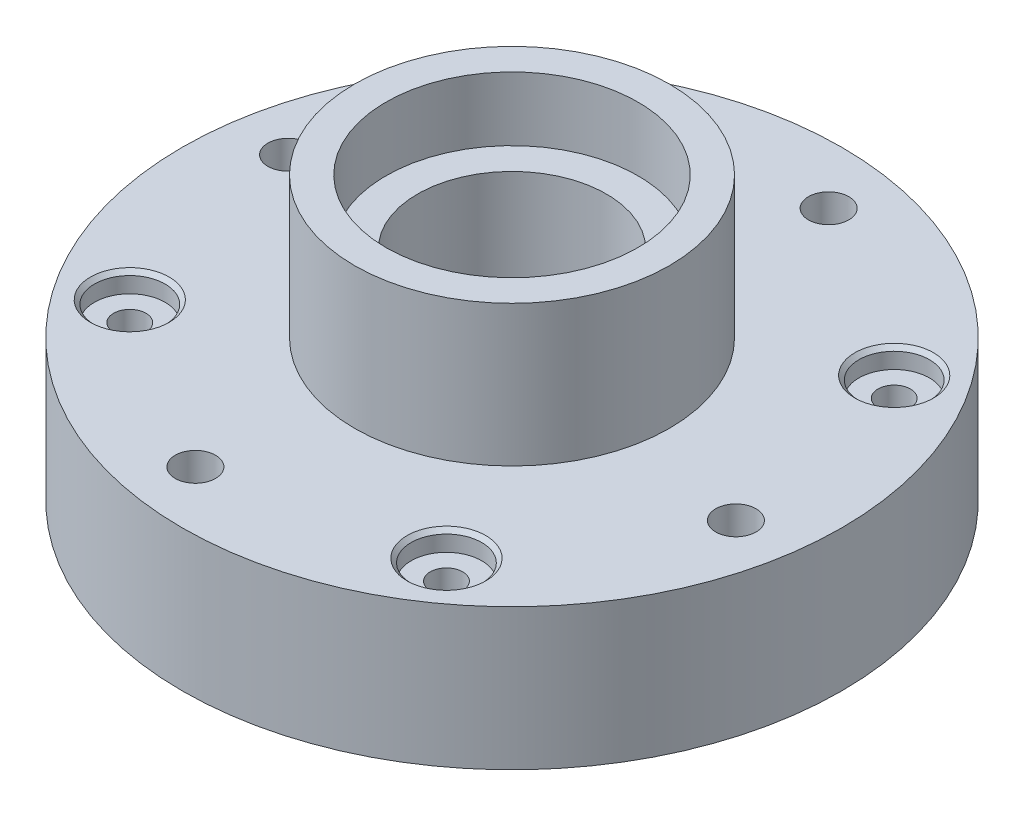
ISO-10303-21;
HEADER;
FILE_DESCRIPTION(('STEP AP214'),'2;1');
FILE_NAME('part.step','',(''),(''),'','','');
FILE_SCHEMA(('AUTOMOTIVE_DESIGN { 1 0 10303 214 1 1 1 1 }'));
ENDSEC;
DATA;
#1=APPLICATION_CONTEXT('core data for automotive mechanical design processes');
#2=APPLICATION_PROTOCOL_DEFINITION('international standard','automotive_design',2000,#1);
#3=PRODUCT_CONTEXT('',#1,'mechanical');
#4=PRODUCT('Part','Part','',(#3));
#5=PRODUCT_RELATED_PRODUCT_CATEGORY('part','',(#4));
#6=PRODUCT_DEFINITION_FORMATION('','',#4);
#7=PRODUCT_DEFINITION_CONTEXT('part definition',#1,'design');
#8=PRODUCT_DEFINITION('design','',#6,#7);
#9=PRODUCT_DEFINITION_SHAPE('','',#8);
#10=(LENGTH_UNIT() NAMED_UNIT(*) SI_UNIT(.MILLI.,.METRE.));
#11=(NAMED_UNIT(*) PLANE_ANGLE_UNIT() SI_UNIT($,.RADIAN.));
#12=(NAMED_UNIT(*) SI_UNIT($,.STERADIAN.) SOLID_ANGLE_UNIT());
#13=UNCERTAINTY_MEASURE_WITH_UNIT(LENGTH_MEASURE(1.E-05),#10,'distance_accuracy_value','');
#14=(GEOMETRIC_REPRESENTATION_CONTEXT(3) GLOBAL_UNCERTAINTY_ASSIGNED_CONTEXT((#13)) GLOBAL_UNIT_ASSIGNED_CONTEXT((#10,
#11,#12)) REPRESENTATION_CONTEXT('',''));
#15=CARTESIAN_POINT('',(0.,0.,0.));
#16=DIRECTION('',(0.,0.,1.));
#17=DIRECTION('',(1.,0.,0.));
#18=AXIS2_PLACEMENT_3D('',#15,#16,#17);
#19=CARTESIAN_POINT('',(0.,36.4264778325123,0.));
#20=DIRECTION('',(0.,1.,0.));
#21=DIRECTION('',(0.,0.,1.));
#22=AXIS2_PLACEMENT_3D('',#19,#20,#21);
#23=CYLINDRICAL_SURFACE('',#22,24.7674954336636);
#24=CARTESIAN_POINT('',(0.,36.4264778325123,0.));
#25=DIRECTION('',(0.,1.,0.));
#26=DIRECTION('',(0.,0.,1.));
#27=AXIS2_PLACEMENT_3D('',#24,#25,#26);
#28=CIRCLE('',#27,24.7674954336636);
#29=CARTESIAN_POINT('',(0.,36.4264778325123,24.7674954336636));
#30=VERTEX_POINT('',#29);
#31=EDGE_CURVE('E11',#30,#30,#28,.T.);
#32=ORIENTED_EDGE('',*,*,#31,.F.);
#33=EDGE_LOOP('',(#32));
#34=FACE_BOUND('',#33,.T.);
#35=CARTESIAN_POINT('',(0.,14.2483990147783,0.));
#36=DIRECTION('',(0.,1.,0.));
#37=DIRECTION('',(0.,0.,1.));
#38=AXIS2_PLACEMENT_3D('',#35,#36,#37);
#39=CIRCLE('',#38,24.7674954336636);
#40=CARTESIAN_POINT('',(0.,14.2483990147783,24.7674954336636));
#41=VERTEX_POINT('',#40);
#42=EDGE_CURVE('E104',#41,#41,#39,.T.);
#43=ORIENTED_EDGE('',*,*,#42,.T.);
#44=EDGE_LOOP('',(#43));
#45=FACE_BOUND('',#44,.T.);
#46=ADVANCED_FACE('F31',(#34,#45),#23,.T.);
#47=CARTESIAN_POINT('',(19.8390678207927,36.4264778325123,0.));
#48=DIRECTION('',(0.,-1.,0.));
#49=DIRECTION('',(0.,0.,-1.));
#50=AXIS2_PLACEMENT_3D('',#47,#48,#49);
#51=PLANE('',#50);
#52=CARTESIAN_POINT('',(0.,36.4264778325123,0.));
#53=DIRECTION('',(0.,1.,0.));
#54=DIRECTION('',(0.,0.,1.));
#55=AXIS2_PLACEMENT_3D('',#52,#53,#54);
#56=CIRCLE('',#55,19.8390678207927);
#57=CARTESIAN_POINT('',(0.,36.4264778325123,19.8390678207927));
#58=VERTEX_POINT('',#57);
#59=EDGE_CURVE('E38',#58,#58,#56,.T.);
#60=ORIENTED_EDGE('',*,*,#59,.F.);
#61=EDGE_LOOP('',(#60));
#62=FACE_BOUND('',#61,.T.);
#63=ORIENTED_EDGE('',*,*,#31,.T.);
#64=EDGE_LOOP('',(#63));
#65=FACE_BOUND('',#64,.T.);
#66=ADVANCED_FACE('F126',(#62,#65),#51,.F.);
#67=CARTESIAN_POINT('',(0.,36.4264778325123,0.));
#68=DIRECTION('',(0.,1.,0.));
#69=DIRECTION('',(0.,0.,1.));
#70=AXIS2_PLACEMENT_3D('',#67,#68,#69);
#71=CYLINDRICAL_SURFACE('',#70,19.8390678207927);
#72=CARTESIAN_POINT('',(0.,26.3797052630036,0.));
#73=DIRECTION('',(0.,1.,0.));
#74=DIRECTION('',(0.,0.,1.));
#75=AXIS2_PLACEMENT_3D('',#72,#73,#74);
#76=CIRCLE('',#75,19.8390678207927);
#77=CARTESIAN_POINT('',(0.,26.3797052630036,19.8390678207927));
#78=VERTEX_POINT('',#77);
#79=EDGE_CURVE('E119',#78,#78,#76,.T.);
#80=ORIENTED_EDGE('',*,*,#79,.F.);
#81=EDGE_LOOP('',(#80));
#82=FACE_BOUND('',#81,.T.);
#83=ORIENTED_EDGE('',*,*,#59,.T.);
#84=EDGE_LOOP('',(#83));
#85=FACE_BOUND('',#84,.T.);
#86=ADVANCED_FACE('F124',(#82,#85),#71,.F.);
#87=CARTESIAN_POINT('',(19.8390678207927,26.3797052630036,0.));
#88=DIRECTION('',(0.,-1.,0.));
#89=DIRECTION('',(0.,0.,-1.));
#90=AXIS2_PLACEMENT_3D('',#87,#88,#89);
#91=PLANE('',#90);
#92=CARTESIAN_POINT('',(0.,26.3797052630036,0.));
#93=DIRECTION('',(0.,1.,0.));
#94=DIRECTION('',(0.,0.,1.));
#95=AXIS2_PLACEMENT_3D('',#92,#93,#94);
#96=CIRCLE('',#95,14.8706651695587);
#97=CARTESIAN_POINT('',(0.,26.3797052630036,14.8706651695587));
#98=VERTEX_POINT('',#97);
#99=EDGE_CURVE('E116',#98,#98,#96,.T.);
#100=ORIENTED_EDGE('',*,*,#99,.F.);
#101=EDGE_LOOP('',(#100));
#102=FACE_BOUND('',#101,.T.);
#103=ORIENTED_EDGE('',*,*,#79,.T.);
#104=EDGE_LOOP('',(#103));
#105=FACE_BOUND('',#104,.T.);
#106=ADVANCED_FACE('F159',(#102,#105),#91,.F.);
#107=CARTESIAN_POINT('',(0.,36.4264778325123,0.));
#108=DIRECTION('',(0.,1.,0.));
#109=DIRECTION('',(0.,0.,1.));
#110=AXIS2_PLACEMENT_3D('',#107,#108,#109);
#111=CYLINDRICAL_SURFACE('',#110,14.8706651695587);
#112=CARTESIAN_POINT('',(0.,-7.97660098522167,0.));
#113=DIRECTION('',(0.,1.,0.));
#114=DIRECTION('',(0.,0.,1.));
#115=AXIS2_PLACEMENT_3D('',#112,#113,#114);
#116=CIRCLE('',#115,14.8706651695587);
#117=CARTESIAN_POINT('',(0.,-7.97660098522167,14.8706651695587));
#118=VERTEX_POINT('',#117);
#119=EDGE_CURVE('E113',#118,#118,#116,.T.);
#120=ORIENTED_EDGE('',*,*,#119,.F.);
#121=EDGE_LOOP('',(#120));
#122=FACE_BOUND('',#121,.T.);
#123=ORIENTED_EDGE('',*,*,#99,.T.);
#124=EDGE_LOOP('',(#123));
#125=FACE_BOUND('',#124,.T.);
#126=ADVANCED_FACE('F152',(#122,#125),#111,.F.);
#127=CARTESIAN_POINT('',(51.8879387834173,-7.97660098522167,0.));
#128=DIRECTION('',(0.,1.,0.));
#129=DIRECTION('',(0.,0.,1.));
#130=AXIS2_PLACEMENT_3D('',#127,#128,#129);
#131=PLANE('',#130);
#132=CARTESIAN_POINT('',(24.9173405201599,-7.97660098522167,35.2340836924472));
#133=DIRECTION('',(0.,1.,0.));
#134=DIRECTION('',(0.,0.,1.));
#135=AXIS2_PLACEMENT_3D('',#132,#133,#134);
#136=CIRCLE('',#135,2.55269999999999);
#137=CARTESIAN_POINT('',(24.9173405201599,-7.97660098522167,37.7867836924472));
#138=VERTEX_POINT('',#137);
#139=EDGE_CURVE('E308',#138,#138,#136,.T.);
#140=ORIENTED_EDGE('',*,*,#139,.T.);
#141=EDGE_LOOP('',(#140));
#142=FACE_BOUND('',#141,.T.);
#143=CARTESIAN_POINT('',(-35.2340836924473,-7.97660098522167,24.9173405201598));
#144=DIRECTION('',(0.,1.,0.));
#145=DIRECTION('',(0.,0.,1.));
#146=AXIS2_PLACEMENT_3D('',#143,#144,#145);
#147=CIRCLE('',#146,2.5527);
#148=CARTESIAN_POINT('',(-35.2340836924473,-7.97660098522167,27.4700405201598));
#149=VERTEX_POINT('',#148);
#150=EDGE_CURVE('E323',#149,#149,#147,.T.);
#151=ORIENTED_EDGE('',*,*,#150,.T.);
#152=EDGE_LOOP('',(#151));
#153=FACE_BOUND('',#152,.T.);
#154=CARTESIAN_POINT('',(-24.9173405201597,-7.97660098522167,-35.2340836924474));
#155=DIRECTION('',(0.,1.,0.));
#156=DIRECTION('',(0.,0.,1.));
#157=AXIS2_PLACEMENT_3D('',#154,#155,#156);
#158=CIRCLE('',#157,2.55269999999999);
#159=CARTESIAN_POINT('',(-24.9173405201597,-7.97660098522167,-32.6813836924474));
#160=VERTEX_POINT('',#159);
#161=EDGE_CURVE('E338',#160,#160,#158,.T.);
#162=ORIENTED_EDGE('',*,*,#161,.T.);
#163=EDGE_LOOP('',(#162));
#164=FACE_BOUND('',#163,.T.);
#165=CARTESIAN_POINT('',(35.2340836924475,-7.97660098522167,-24.9173405201596));
#166=DIRECTION('',(0.,1.,0.));
#167=DIRECTION('',(0.,0.,1.));
#168=AXIS2_PLACEMENT_3D('',#165,#166,#167);
#169=CIRCLE('',#168,2.5527);
#170=CARTESIAN_POINT('',(35.2340836924475,-7.97660098522167,-22.3646405201596));
#171=VERTEX_POINT('',#170);
#172=EDGE_CURVE('E353',#171,#171,#169,.T.);
#173=ORIENTED_EDGE('',*,*,#172,.T.);
#174=EDGE_LOOP('',(#173));
#175=FACE_BOUND('',#174,.T.);
#176=CARTESIAN_POINT('',(0.,-7.97660098522167,0.));
#177=DIRECTION('',(0.,1.,0.));
#178=DIRECTION('',(0.,0.,1.));
#179=AXIS2_PLACEMENT_3D('',#176,#177,#178);
#180=CIRCLE('',#179,51.8879387834173);
#181=CARTESIAN_POINT('',(0.,-7.97660098522167,51.8879387834173));
#182=VERTEX_POINT('',#181);
#183=EDGE_CURVE('E110',#182,#182,#180,.T.);
#184=ORIENTED_EDGE('',*,*,#183,.F.);
#185=EDGE_LOOP('',(#184));
#186=FACE_BOUND('',#185,.T.);
#187=ORIENTED_EDGE('',*,*,#119,.T.);
#188=EDGE_LOOP('',(#187));
#189=FACE_BOUND('',#188,.T.);
#190=ADVANCED_FACE('F146',(#142,#153,#164,#175,#186,#189),#131,.F.);
#191=CARTESIAN_POINT('',(0.,36.4264778325123,0.));
#192=DIRECTION('',(0.,1.,0.));
#193=DIRECTION('',(0.,0.,1.));
#194=AXIS2_PLACEMENT_3D('',#191,#192,#193);
#195=CYLINDRICAL_SURFACE('',#194,51.8879387834173);
#196=CARTESIAN_POINT('',(0.,14.2483990147783,0.));
#197=DIRECTION('',(0.,1.,0.));
#198=DIRECTION('',(0.,0.,1.));
#199=AXIS2_PLACEMENT_3D('',#196,#197,#198);
#200=CIRCLE('',#199,51.8879387834173);
#201=CARTESIAN_POINT('',(0.,14.2483990147783,51.8879387834173));
#202=VERTEX_POINT('',#201);
#203=EDGE_CURVE('E107',#202,#202,#200,.T.);
#204=ORIENTED_EDGE('',*,*,#203,.F.);
#205=EDGE_LOOP('',(#204));
#206=FACE_BOUND('',#205,.T.);
#207=ORIENTED_EDGE('',*,*,#183,.T.);
#208=EDGE_LOOP('',(#207));
#209=FACE_BOUND('',#208,.T.);
#210=ADVANCED_FACE('F139',(#206,#209),#195,.T.);
#211=CARTESIAN_POINT('',(24.7674954336636,14.2483990147783,0.));
#212=DIRECTION('',(0.,-1.,0.));
#213=DIRECTION('',(0.,0.,-1.));
#214=AXIS2_PLACEMENT_3D('',#211,#212,#213);
#215=PLANE('',#214);
#216=CARTESIAN_POINT('',(24.9173405201599,14.2483990147783,35.2340836924472));
#217=DIRECTION('',(0.,1.,0.));
#218=DIRECTION('',(0.,0.,1.));
#219=AXIS2_PLACEMENT_3D('',#216,#217,#218);
#220=CIRCLE('',#219,6.19125);
#221=CARTESIAN_POINT('',(24.9173405201599,14.2483990147783,41.4253336924472));
#222=VERTEX_POINT('',#221);
#223=EDGE_CURVE('E298',#222,#222,#220,.T.);
#224=ORIENTED_EDGE('',*,*,#223,.F.);
#225=EDGE_LOOP('',(#224));
#226=FACE_BOUND('',#225,.T.);
#227=CARTESIAN_POINT('',(-35.2340836924473,14.2483990147783,24.9173405201598));
#228=DIRECTION('',(0.,1.,0.));
#229=DIRECTION('',(0.,0.,1.));
#230=AXIS2_PLACEMENT_3D('',#227,#228,#229);
#231=CIRCLE('',#230,6.19125);
#232=CARTESIAN_POINT('',(-35.2340836924473,14.2483990147783,31.1085905201598));
#233=VERTEX_POINT('',#232);
#234=EDGE_CURVE('E311',#233,#233,#231,.T.);
#235=ORIENTED_EDGE('',*,*,#234,.F.);
#236=EDGE_LOOP('',(#235));
#237=FACE_BOUND('',#236,.T.);
#238=CARTESIAN_POINT('',(-24.9173405201597,14.2483990147783,-35.2340836924474));
#239=DIRECTION('',(0.,1.,0.));
#240=DIRECTION('',(0.,0.,1.));
#241=AXIS2_PLACEMENT_3D('',#238,#239,#240);
#242=CIRCLE('',#241,6.19125);
#243=CARTESIAN_POINT('',(-24.9173405201597,14.2483990147783,-29.0428336924474));
#244=VERTEX_POINT('',#243);
#245=EDGE_CURVE('E326',#244,#244,#242,.T.);
#246=ORIENTED_EDGE('',*,*,#245,.F.);
#247=EDGE_LOOP('',(#246));
#248=FACE_BOUND('',#247,.T.);
#249=CARTESIAN_POINT('',(35.2340836924475,14.2483990147783,-24.9173405201596));
#250=DIRECTION('',(0.,1.,0.));
#251=DIRECTION('',(0.,0.,1.));
#252=AXIS2_PLACEMENT_3D('',#249,#250,#251);
#253=CIRCLE('',#252,6.19125);
#254=CARTESIAN_POINT('',(35.2340836924475,14.2483990147783,-18.7260905201596));
#255=VERTEX_POINT('',#254);
#256=EDGE_CURVE('E341',#255,#255,#253,.T.);
#257=ORIENTED_EDGE('',*,*,#256,.F.);
#258=EDGE_LOOP('',(#257));
#259=FACE_BOUND('',#258,.T.);
#260=CARTESIAN_POINT('',(-7.29503905688444,14.2483990147783,42.5334799587632));
#261=DIRECTION('',(0.,1.,0.));
#262=DIRECTION('',(0.,0.,1.));
#263=AXIS2_PLACEMENT_3D('',#260,#261,#262);
#264=CIRCLE('',#263,3.17499999999999);
#265=CARTESIAN_POINT('',(-7.29503905688444,14.2483990147783,45.7084799587632));
#266=VERTEX_POINT('',#265);
#267=EDGE_CURVE('E356',#266,#266,#264,.T.);
#268=ORIENTED_EDGE('',*,*,#267,.F.);
#269=EDGE_LOOP('',(#268));
#270=FACE_BOUND('',#269,.T.);
#271=CARTESIAN_POINT('',(-42.5334799587632,14.2483990147783,-7.29503905688459));
#272=DIRECTION('',(0.,1.,0.));
#273=DIRECTION('',(0.,0.,1.));
#274=AXIS2_PLACEMENT_3D('',#271,#272,#273);
#275=CIRCLE('',#274,3.17499999999999);
#276=CARTESIAN_POINT('',(-42.5334799587632,14.2483990147783,-4.1200390568846));
#277=VERTEX_POINT('',#276);
#278=EDGE_CURVE('E61',#277,#277,#275,.T.);
#279=ORIENTED_EDGE('',*,*,#278,.F.);
#280=EDGE_LOOP('',(#279));
#281=FACE_BOUND('',#280,.T.);
#282=CARTESIAN_POINT('',(7.29503905688474,14.2483990147783,-42.5334799587631));
#283=DIRECTION('',(0.,1.,0.));
#284=DIRECTION('',(0.,0.,1.));
#285=AXIS2_PLACEMENT_3D('',#282,#283,#284);
#286=CIRCLE('',#285,3.17499999999999);
#287=CARTESIAN_POINT('',(7.29503905688474,14.2483990147783,-39.3584799587631));
#288=VERTEX_POINT('',#287);
#289=EDGE_CURVE('E80',#288,#288,#286,.T.);
#290=ORIENTED_EDGE('',*,*,#289,.F.);
#291=EDGE_LOOP('',(#290));
#292=FACE_BOUND('',#291,.T.);
#293=CARTESIAN_POINT('',(42.5334799587631,14.2483990147783,7.29503905688489));
#294=DIRECTION('',(0.,1.,0.));
#295=DIRECTION('',(0.,0.,1.));
#296=AXIS2_PLACEMENT_3D('',#293,#294,#295);
#297=CIRCLE('',#296,3.175);
#298=CARTESIAN_POINT('',(42.5334799587631,14.2483990147783,10.4700390568849));
#299=VERTEX_POINT('',#298);
#300=EDGE_CURVE('E92',#299,#299,#297,.T.);
#301=ORIENTED_EDGE('',*,*,#300,.F.);
#302=EDGE_LOOP('',(#301));
#303=FACE_BOUND('',#302,.T.);
#304=ORIENTED_EDGE('',*,*,#42,.F.);
#305=EDGE_LOOP('',(#304));
#306=FACE_BOUND('',#305,.T.);
#307=ORIENTED_EDGE('',*,*,#203,.T.);
#308=EDGE_LOOP('',(#307));
#309=FACE_BOUND('',#308,.T.);
#310=ADVANCED_FACE('F135',(#226,#237,#248,#259,#270,#281,#292,#303,#306,#309),#215,.F.);
#311=CARTESIAN_POINT('',(42.5334799587631,-2.26160098522166,7.29503905688489));
#312=DIRECTION('',(0.,1.,0.));
#313=DIRECTION('',(0.,0.,1.));
#314=AXIS2_PLACEMENT_3D('',#311,#312,#313);
#315=CONICAL_SURFACE('',#314,2.55269999999999,1.02974425867665);
#316=CARTESIAN_POINT('',(42.5334799587631,-3.79541788741331,7.29503905688489));
#317=VERTEX_POINT('',#316);
#318=VERTEX_LOOP('',#317);
#319=FACE_BOUND('',#318,.T.);
#320=CARTESIAN_POINT('',(42.5334799587631,-2.26160098522166,7.29503905688489));
#321=DIRECTION('',(0.,1.,0.));
#322=DIRECTION('',(0.,0.,1.));
#323=AXIS2_PLACEMENT_3D('',#320,#321,#322);
#324=CIRCLE('',#323,2.55269999999999);
#325=CARTESIAN_POINT('',(42.5334799587631,-2.26160098522166,9.84773905688488));
#326=VERTEX_POINT('',#325);
#327=EDGE_CURVE('E101',#326,#326,#324,.T.);
#328=ORIENTED_EDGE('',*,*,#327,.T.);
#329=EDGE_LOOP('',(#328));
#330=FACE_BOUND('',#329,.T.);
#331=ADVANCED_FACE('F138',(#319,#330),#315,.F.);
#332=CARTESIAN_POINT('',(42.5334799587631,14.2483990147783,7.29503905688489));
#333=DIRECTION('',(0.,1.,0.));
#334=DIRECTION('',(0.,0.,1.));
#335=AXIS2_PLACEMENT_3D('',#332,#333,#334);
#336=CYLINDRICAL_SURFACE('',#335,2.55269999999999);
#337=ORIENTED_EDGE('',*,*,#327,.F.);
#338=EDGE_LOOP('',(#337));
#339=FACE_BOUND('',#338,.T.);
#340=CARTESIAN_POINT('',(42.5334799587631,1.54839901477834,7.29503905688489));
#341=DIRECTION('',(0.,1.,0.));
#342=DIRECTION('',(0.,0.,1.));
#343=AXIS2_PLACEMENT_3D('',#340,#341,#342);
#344=CIRCLE('',#343,2.55269999999999);
#345=CARTESIAN_POINT('',(42.5334799587631,1.54839901477834,9.84773905688488));
#346=VERTEX_POINT('',#345);
#347=EDGE_CURVE('E98',#346,#346,#344,.T.);
#348=ORIENTED_EDGE('',*,*,#347,.T.);
#349=EDGE_LOOP('',(#348));
#350=FACE_BOUND('',#349,.T.);
#351=ADVANCED_FACE('F175',(#339,#350),#336,.F.);
#352=CARTESIAN_POINT('',(45.0861799587631,1.54839901477834,7.29503905688489));
#353=DIRECTION('',(0.,-1.,0.));
#354=DIRECTION('',(0.,0.,-1.));
#355=AXIS2_PLACEMENT_3D('',#352,#353,#354);
#356=PLANE('',#355);
#357=ORIENTED_EDGE('',*,*,#347,.F.);
#358=EDGE_LOOP('',(#357));
#359=FACE_BOUND('',#358,.T.);
#360=CARTESIAN_POINT('',(42.5334799587631,1.54839901477833,7.29503905688489));
#361=DIRECTION('',(0.,1.,0.));
#362=DIRECTION('',(0.,0.,1.));
#363=AXIS2_PLACEMENT_3D('',#360,#361,#362);
#364=CIRCLE('',#363,3.17499999999999);
#365=CARTESIAN_POINT('',(42.5334799587631,1.54839901477833,10.4700390568849));
#366=VERTEX_POINT('',#365);
#367=EDGE_CURVE('E95',#366,#366,#364,.T.);
#368=ORIENTED_EDGE('',*,*,#367,.T.);
#369=EDGE_LOOP('',(#368));
#370=FACE_BOUND('',#369,.T.);
#371=ADVANCED_FACE('F178',(#359,#370),#356,.F.);
#372=CARTESIAN_POINT('',(42.5334799587631,14.2483990147783,7.29503905688489));
#373=DIRECTION('',(0.,1.,0.));
#374=DIRECTION('',(0.,0.,1.));
#375=AXIS2_PLACEMENT_3D('',#372,#373,#374);
#376=CYLINDRICAL_SURFACE('',#375,3.17499999999999);
#377=ORIENTED_EDGE('',*,*,#367,.F.);
#378=EDGE_LOOP('',(#377));
#379=FACE_BOUND('',#378,.T.);
#380=ORIENTED_EDGE('',*,*,#300,.T.);
#381=EDGE_LOOP('',(#380));
#382=FACE_BOUND('',#381,.T.);
#383=ADVANCED_FACE('F182',(#379,#382),#376,.F.);
#384=CARTESIAN_POINT('',(7.29503905688474,-2.26160098522166,-42.5334799587631));
#385=DIRECTION('',(0.,1.,0.));
#386=DIRECTION('',(0.,0.,1.));
#387=AXIS2_PLACEMENT_3D('',#384,#385,#386);
#388=CONICAL_SURFACE('',#387,2.55269999999999,1.02974425867665);
#389=CARTESIAN_POINT('',(7.29503905688474,-3.79541788741331,-42.5334799587631));
#390=VERTEX_POINT('',#389);
#391=VERTEX_LOOP('',#390);
#392=FACE_BOUND('',#391,.T.);
#393=CARTESIAN_POINT('',(7.29503905688474,-2.26160098522166,-42.5334799587631));
#394=DIRECTION('',(0.,1.,0.));
#395=DIRECTION('',(0.,0.,1.));
#396=AXIS2_PLACEMENT_3D('',#393,#394,#395);
#397=CIRCLE('',#396,2.55269999999999);
#398=CARTESIAN_POINT('',(7.29503905688474,-2.26160098522166,-39.9807799587631));
#399=VERTEX_POINT('',#398);
#400=EDGE_CURVE('E89',#399,#399,#397,.T.);
#401=ORIENTED_EDGE('',*,*,#400,.T.);
#402=EDGE_LOOP('',(#401));
#403=FACE_BOUND('',#402,.T.);
#404=ADVANCED_FACE('F186',(#392,#403),#388,.F.);
#405=CARTESIAN_POINT('',(7.29503905688474,14.2483990147783,-42.5334799587631));
#406=DIRECTION('',(0.,1.,0.));
#407=DIRECTION('',(0.,0.,1.));
#408=AXIS2_PLACEMENT_3D('',#405,#406,#407);
#409=CYLINDRICAL_SURFACE('',#408,2.55269999999999);
#410=ORIENTED_EDGE('',*,*,#400,.F.);
#411=EDGE_LOOP('',(#410));
#412=FACE_BOUND('',#411,.T.);
#413=CARTESIAN_POINT('',(7.29503905688474,1.54839901477834,-42.5334799587631));
#414=DIRECTION('',(0.,1.,0.));
#415=DIRECTION('',(0.,0.,1.));
#416=AXIS2_PLACEMENT_3D('',#413,#414,#415);
#417=CIRCLE('',#416,2.55269999999999);
#418=CARTESIAN_POINT('',(7.29503905688474,1.54839901477834,-39.9807799587631));
#419=VERTEX_POINT('',#418);
#420=EDGE_CURVE('E86',#419,#419,#417,.T.);
#421=ORIENTED_EDGE('',*,*,#420,.T.);
#422=EDGE_LOOP('',(#421));
#423=FACE_BOUND('',#422,.T.);
#424=ADVANCED_FACE('F190',(#412,#423),#409,.F.);
#425=CARTESIAN_POINT('',(9.84773905688473,1.54839901477834,-42.5334799587631));
#426=DIRECTION('',(0.,-1.,0.));
#427=DIRECTION('',(0.,0.,-1.));
#428=AXIS2_PLACEMENT_3D('',#425,#426,#427);
#429=PLANE('',#428);
#430=ORIENTED_EDGE('',*,*,#420,.F.);
#431=EDGE_LOOP('',(#430));
#432=FACE_BOUND('',#431,.T.);
#433=CARTESIAN_POINT('',(7.29503905688474,1.54839901477833,-42.5334799587631));
#434=DIRECTION('',(0.,1.,0.));
#435=DIRECTION('',(0.,0.,1.));
#436=AXIS2_PLACEMENT_3D('',#433,#434,#435);
#437=CIRCLE('',#436,3.17499999999999);
#438=CARTESIAN_POINT('',(7.29503905688474,1.54839901477833,-39.3584799587631));
#439=VERTEX_POINT('',#438);
#440=EDGE_CURVE('E83',#439,#439,#437,.T.);
#441=ORIENTED_EDGE('',*,*,#440,.T.);
#442=EDGE_LOOP('',(#441));
#443=FACE_BOUND('',#442,.T.);
#444=ADVANCED_FACE('F193',(#432,#443),#429,.F.);
#445=CARTESIAN_POINT('',(7.29503905688474,14.2483990147783,-42.5334799587631));
#446=DIRECTION('',(0.,1.,0.));
#447=DIRECTION('',(0.,0.,1.));
#448=AXIS2_PLACEMENT_3D('',#445,#446,#447);
#449=CYLINDRICAL_SURFACE('',#448,3.17499999999999);
#450=ORIENTED_EDGE('',*,*,#440,.F.);
#451=EDGE_LOOP('',(#450));
#452=FACE_BOUND('',#451,.T.);
#453=ORIENTED_EDGE('',*,*,#289,.T.);
#454=EDGE_LOOP('',(#453));
#455=FACE_BOUND('',#454,.T.);
#456=ADVANCED_FACE('F197',(#452,#455),#449,.F.);
#457=CARTESIAN_POINT('',(-42.5334799587632,-2.26160098522166,-7.29503905688459));
#458=DIRECTION('',(0.,1.,0.));
#459=DIRECTION('',(0.,0.,1.));
#460=AXIS2_PLACEMENT_3D('',#457,#458,#459);
#461=CONICAL_SURFACE('',#460,2.5527,1.02974425867666);
#462=CARTESIAN_POINT('',(-42.5334799587632,-3.79541788741331,-7.29503905688459));
#463=VERTEX_POINT('',#462);
#464=VERTEX_LOOP('',#463);
#465=FACE_BOUND('',#464,.T.);
#466=CARTESIAN_POINT('',(-42.5334799587632,-2.26160098522166,-7.29503905688459));
#467=DIRECTION('',(0.,1.,0.));
#468=DIRECTION('',(0.,0.,1.));
#469=AXIS2_PLACEMENT_3D('',#466,#467,#468);
#470=CIRCLE('',#469,2.5527);
#471=CARTESIAN_POINT('',(-42.5334799587632,-2.26160098522166,-4.74233905688459));
#472=VERTEX_POINT('',#471);
#473=EDGE_CURVE('E77',#472,#472,#470,.T.);
#474=ORIENTED_EDGE('',*,*,#473,.T.);
#475=EDGE_LOOP('',(#474));
#476=FACE_BOUND('',#475,.T.);
#477=ADVANCED_FACE('F201',(#465,#476),#461,.F.);
#478=CARTESIAN_POINT('',(-42.5334799587632,14.2483990147783,-7.29503905688459));
#479=DIRECTION('',(0.,1.,0.));
#480=DIRECTION('',(0.,0.,1.));
#481=AXIS2_PLACEMENT_3D('',#478,#479,#480);
#482=CYLINDRICAL_SURFACE('',#481,2.55269999999999);
#483=ORIENTED_EDGE('',*,*,#473,.F.);
#484=EDGE_LOOP('',(#483));
#485=FACE_BOUND('',#484,.T.);
#486=CARTESIAN_POINT('',(-42.5334799587632,1.54839901477834,-7.29503905688459));
#487=DIRECTION('',(0.,1.,0.));
#488=DIRECTION('',(0.,0.,1.));
#489=AXIS2_PLACEMENT_3D('',#486,#487,#488);
#490=CIRCLE('',#489,2.55269999999999);
#491=CARTESIAN_POINT('',(-42.5334799587632,1.54839901477834,-4.7423390568846));
#492=VERTEX_POINT('',#491);
#493=EDGE_CURVE('E74',#492,#492,#490,.T.);
#494=ORIENTED_EDGE('',*,*,#493,.T.);
#495=EDGE_LOOP('',(#494));
#496=FACE_BOUND('',#495,.T.);
#497=ADVANCED_FACE('F205',(#485,#496),#482,.F.);
#498=CARTESIAN_POINT('',(-39.9807799587632,1.54839901477834,-7.29503905688459));
#499=DIRECTION('',(0.,-1.,0.));
#500=DIRECTION('',(0.,0.,-1.));
#501=AXIS2_PLACEMENT_3D('',#498,#499,#500);
#502=PLANE('',#501);
#503=ORIENTED_EDGE('',*,*,#493,.F.);
#504=EDGE_LOOP('',(#503));
#505=FACE_BOUND('',#504,.T.);
#506=CARTESIAN_POINT('',(-42.5334799587632,1.54839901477833,-7.29503905688459));
#507=DIRECTION('',(0.,1.,0.));
#508=DIRECTION('',(0.,0.,1.));
#509=AXIS2_PLACEMENT_3D('',#506,#507,#508);
#510=CIRCLE('',#509,3.17499999999999);
#511=CARTESIAN_POINT('',(-42.5334799587632,1.54839901477833,-4.1200390568846));
#512=VERTEX_POINT('',#511);
#513=EDGE_CURVE('E65',#512,#512,#510,.T.);
#514=ORIENTED_EDGE('',*,*,#513,.T.);
#515=EDGE_LOOP('',(#514));
#516=FACE_BOUND('',#515,.T.);
#517=ADVANCED_FACE('F209',(#505,#516),#502,.F.);
#518=CARTESIAN_POINT('',(-42.5334799587632,14.2483990147783,-7.29503905688459));
#519=DIRECTION('',(0.,1.,0.));
#520=DIRECTION('',(0.,0.,1.));
#521=AXIS2_PLACEMENT_3D('',#518,#519,#520);
#522=CYLINDRICAL_SURFACE('',#521,3.17499999999999);
#523=ORIENTED_EDGE('',*,*,#513,.F.);
#524=EDGE_LOOP('',(#523));
#525=FACE_BOUND('',#524,.T.);
#526=ORIENTED_EDGE('',*,*,#278,.T.);
#527=EDGE_LOOP('',(#526));
#528=FACE_BOUND('',#527,.T.);
#529=ADVANCED_FACE('F55',(#525,#528),#522,.F.);
#530=CARTESIAN_POINT('',(-7.29503905688444,-2.26160098522166,42.5334799587632));
#531=DIRECTION('',(0.,1.,0.));
#532=DIRECTION('',(0.,0.,1.));
#533=AXIS2_PLACEMENT_3D('',#530,#531,#532);
#534=CONICAL_SURFACE('',#533,2.55269999999999,1.02974425867665);
#535=CARTESIAN_POINT('',(-7.29503905688445,-3.79541788741331,42.5334799587632));
#536=VERTEX_POINT('',#535);
#537=VERTEX_LOOP('',#536);
#538=FACE_BOUND('',#537,.T.);
#539=CARTESIAN_POINT('',(-7.29503905688444,-2.26160098522166,42.5334799587632));
#540=DIRECTION('',(0.,1.,0.));
#541=DIRECTION('',(0.,0.,1.));
#542=AXIS2_PLACEMENT_3D('',#539,#540,#541);
#543=CIRCLE('',#542,2.55269999999999);
#544=CARTESIAN_POINT('',(-7.29503905688444,-2.26160098522166,45.0861799587632));
#545=VERTEX_POINT('',#544);
#546=EDGE_CURVE('E59',#545,#545,#543,.T.);
#547=ORIENTED_EDGE('',*,*,#546,.T.);
#548=EDGE_LOOP('',(#547));
#549=FACE_BOUND('',#548,.T.);
#550=ADVANCED_FACE('F51',(#538,#549),#534,.F.);
#551=CARTESIAN_POINT('',(-7.29503905688444,14.2483990147783,42.5334799587632));
#552=DIRECTION('',(0.,1.,0.));
#553=DIRECTION('',(0.,0.,1.));
#554=AXIS2_PLACEMENT_3D('',#551,#552,#553);
#555=CYLINDRICAL_SURFACE('',#554,2.55269999999999);
#556=ORIENTED_EDGE('',*,*,#546,.F.);
#557=EDGE_LOOP('',(#556));
#558=FACE_BOUND('',#557,.T.);
#559=CARTESIAN_POINT('',(-7.29503905688444,1.54839901477834,42.5334799587632));
#560=DIRECTION('',(0.,1.,0.));
#561=DIRECTION('',(0.,0.,1.));
#562=AXIS2_PLACEMENT_3D('',#559,#560,#561);
#563=CIRCLE('',#562,2.55269999999999);
#564=CARTESIAN_POINT('',(-7.29503905688444,1.54839901477834,45.0861799587632));
#565=VERTEX_POINT('',#564);
#566=EDGE_CURVE('E62',#565,#565,#563,.T.);
#567=ORIENTED_EDGE('',*,*,#566,.T.);
#568=EDGE_LOOP('',(#567));
#569=FACE_BOUND('',#568,.T.);
#570=ADVANCED_FACE('F54',(#558,#569),#555,.F.);
#571=CARTESIAN_POINT('',(-4.74233905688445,1.54839901477834,42.5334799587632));
#572=DIRECTION('',(0.,-1.,0.));
#573=DIRECTION('',(0.,0.,-1.));
#574=AXIS2_PLACEMENT_3D('',#571,#572,#573);
#575=PLANE('',#574);
#576=ORIENTED_EDGE('',*,*,#566,.F.);
#577=EDGE_LOOP('',(#576));
#578=FACE_BOUND('',#577,.T.);
#579=CARTESIAN_POINT('',(-7.29503905688444,1.54839901477833,42.5334799587632));
#580=DIRECTION('',(0.,1.,0.));
#581=DIRECTION('',(0.,0.,1.));
#582=AXIS2_PLACEMENT_3D('',#579,#580,#581);
#583=CIRCLE('',#582,3.17499999999999);
#584=CARTESIAN_POINT('',(-7.29503905688444,1.54839901477833,45.7084799587632));
#585=VERTEX_POINT('',#584);
#586=EDGE_CURVE('E68',#585,#585,#583,.T.);
#587=ORIENTED_EDGE('',*,*,#586,.T.);
#588=EDGE_LOOP('',(#587));
#589=FACE_BOUND('',#588,.T.);
#590=ADVANCED_FACE('F219',(#578,#589),#575,.F.);
#591=CARTESIAN_POINT('',(-7.29503905688444,14.2483990147783,42.5334799587632));
#592=DIRECTION('',(0.,1.,0.));
#593=DIRECTION('',(0.,0.,1.));
#594=AXIS2_PLACEMENT_3D('',#591,#592,#593);
#595=CYLINDRICAL_SURFACE('',#594,3.17499999999999);
#596=ORIENTED_EDGE('',*,*,#586,.F.);
#597=EDGE_LOOP('',(#596));
#598=FACE_BOUND('',#597,.T.);
#599=ORIENTED_EDGE('',*,*,#267,.T.);
#600=EDGE_LOOP('',(#599));
#601=FACE_BOUND('',#600,.T.);
#602=ADVANCED_FACE('F222',(#598,#601),#595,.F.);
#603=CARTESIAN_POINT('',(35.2340836924475,14.2483990147783,-24.9173405201596));
#604=DIRECTION('',(0.,1.,0.));
#605=DIRECTION('',(0.,0.,1.));
#606=AXIS2_PLACEMENT_3D('',#603,#604,#605);
#607=CYLINDRICAL_SURFACE('',#606,2.5527);
#608=ORIENTED_EDGE('',*,*,#172,.F.);
#609=EDGE_LOOP('',(#608));
#610=FACE_BOUND('',#609,.T.);
#611=CARTESIAN_POINT('',(35.2340836924475,11.1241990147783,-24.9173405201596));
#612=DIRECTION('',(0.,1.,0.));
#613=DIRECTION('',(0.,0.,1.));
#614=AXIS2_PLACEMENT_3D('',#611,#612,#613);
#615=CIRCLE('',#614,2.55270000000001);
#616=CARTESIAN_POINT('',(35.2340836924475,11.1241990147783,-22.3646405201596));
#617=VERTEX_POINT('',#616);
#618=EDGE_CURVE('E350',#617,#617,#615,.T.);
#619=ORIENTED_EDGE('',*,*,#618,.T.);
#620=EDGE_LOOP('',(#619));
#621=FACE_BOUND('',#620,.T.);
#622=ADVANCED_FACE('F226',(#610,#621),#607,.F.);
#623=CARTESIAN_POINT('',(40.7903336924475,11.1241990147783,-24.9173405201596));
#624=DIRECTION('',(0.,-1.,0.));
#625=DIRECTION('',(0.,0.,-1.));
#626=AXIS2_PLACEMENT_3D('',#623,#624,#625);
#627=PLANE('',#626);
#628=ORIENTED_EDGE('',*,*,#618,.F.);
#629=EDGE_LOOP('',(#628));
#630=FACE_BOUND('',#629,.T.);
#631=CARTESIAN_POINT('',(35.2340836924475,11.1241990147783,-24.9173405201596));
#632=DIRECTION('',(0.,1.,0.));
#633=DIRECTION('',(0.,0.,1.));
#634=AXIS2_PLACEMENT_3D('',#631,#632,#633);
#635=CIRCLE('',#634,5.55625);
#636=CARTESIAN_POINT('',(35.2340836924475,11.1241990147783,-19.3610905201596));
#637=VERTEX_POINT('',#636);
#638=EDGE_CURVE('E347',#637,#637,#635,.T.);
#639=ORIENTED_EDGE('',*,*,#638,.T.);
#640=EDGE_LOOP('',(#639));
#641=FACE_BOUND('',#640,.T.);
#642=ADVANCED_FACE('F230',(#630,#641),#627,.F.);
#643=CARTESIAN_POINT('',(35.2340836924475,14.2483990147783,-24.9173405201596));
#644=DIRECTION('',(0.,1.,0.));
#645=DIRECTION('',(0.,0.,1.));
#646=AXIS2_PLACEMENT_3D('',#643,#644,#645);
#647=CYLINDRICAL_SURFACE('',#646,5.55625);
#648=ORIENTED_EDGE('',*,*,#638,.F.);
#649=EDGE_LOOP('',(#648));
#650=FACE_BOUND('',#649,.T.);
#651=CARTESIAN_POINT('',(35.2340836924475,13.6133990147783,-24.9173405201596));
#652=DIRECTION('',(0.,1.,0.));
#653=DIRECTION('',(0.,0.,1.));
#654=AXIS2_PLACEMENT_3D('',#651,#652,#653);
#655=CIRCLE('',#654,5.55625);
#656=CARTESIAN_POINT('',(35.2340836924475,13.6133990147783,-19.3610905201596));
#657=VERTEX_POINT('',#656);
#658=EDGE_CURVE('E344',#657,#657,#655,.T.);
#659=ORIENTED_EDGE('',*,*,#658,.T.);
#660=EDGE_LOOP('',(#659));
#661=FACE_BOUND('',#660,.T.);
#662=ADVANCED_FACE('F234',(#650,#661),#647,.F.);
#663=CARTESIAN_POINT('',(35.2340836924475,14.2483990147783,-24.9173405201596));
#664=DIRECTION('',(0.,1.,0.));
#665=DIRECTION('',(0.,0.,1.));
#666=AXIS2_PLACEMENT_3D('',#663,#664,#665);
#667=CONICAL_SURFACE('',#666,6.19125,0.785398163397452);
#668=ORIENTED_EDGE('',*,*,#658,.F.);
#669=EDGE_LOOP('',(#668));
#670=FACE_BOUND('',#669,.T.);
#671=ORIENTED_EDGE('',*,*,#256,.T.);
#672=EDGE_LOOP('',(#671));
#673=FACE_BOUND('',#672,.T.);
#674=ADVANCED_FACE('F238',(#670,#673),#667,.F.);
#675=CARTESIAN_POINT('',(-24.9173405201597,14.2483990147783,-35.2340836924474));
#676=DIRECTION('',(0.,1.,0.));
#677=DIRECTION('',(0.,0.,1.));
#678=AXIS2_PLACEMENT_3D('',#675,#676,#677);
#679=CYLINDRICAL_SURFACE('',#678,2.5527);
#680=ORIENTED_EDGE('',*,*,#161,.F.);
#681=EDGE_LOOP('',(#680));
#682=FACE_BOUND('',#681,.T.);
#683=CARTESIAN_POINT('',(-24.9173405201597,11.1241990147783,-35.2340836924474));
#684=DIRECTION('',(0.,1.,0.));
#685=DIRECTION('',(0.,0.,1.));
#686=AXIS2_PLACEMENT_3D('',#683,#684,#685);
#687=CIRCLE('',#686,2.5527);
#688=CARTESIAN_POINT('',(-24.9173405201597,11.1241990147783,-32.6813836924474));
#689=VERTEX_POINT('',#688);
#690=EDGE_CURVE('E335',#689,#689,#687,.T.);
#691=ORIENTED_EDGE('',*,*,#690,.T.);
#692=EDGE_LOOP('',(#691));
#693=FACE_BOUND('',#692,.T.);
#694=ADVANCED_FACE('F242',(#682,#693),#679,.F.);
#695=CARTESIAN_POINT('',(-19.3610905201597,11.1241990147783,-35.2340836924474));
#696=DIRECTION('',(0.,-1.,0.));
#697=DIRECTION('',(0.,0.,-1.));
#698=AXIS2_PLACEMENT_3D('',#695,#696,#697);
#699=PLANE('',#698);
#700=ORIENTED_EDGE('',*,*,#690,.F.);
#701=EDGE_LOOP('',(#700));
#702=FACE_BOUND('',#701,.T.);
#703=CARTESIAN_POINT('',(-24.9173405201597,11.1241990147783,-35.2340836924474));
#704=DIRECTION('',(0.,1.,0.));
#705=DIRECTION('',(0.,0.,1.));
#706=AXIS2_PLACEMENT_3D('',#703,#704,#705);
#707=CIRCLE('',#706,5.55625);
#708=CARTESIAN_POINT('',(-24.9173405201597,11.1241990147783,-29.6778336924474));
#709=VERTEX_POINT('',#708);
#710=EDGE_CURVE('E332',#709,#709,#707,.T.);
#711=ORIENTED_EDGE('',*,*,#710,.T.);
#712=EDGE_LOOP('',(#711));
#713=FACE_BOUND('',#712,.T.);
#714=ADVANCED_FACE('F246',(#702,#713),#699,.F.);
#715=CARTESIAN_POINT('',(-24.9173405201597,14.2483990147783,-35.2340836924474));
#716=DIRECTION('',(0.,1.,0.));
#717=DIRECTION('',(0.,0.,1.));
#718=AXIS2_PLACEMENT_3D('',#715,#716,#717);
#719=CYLINDRICAL_SURFACE('',#718,5.55625);
#720=ORIENTED_EDGE('',*,*,#710,.F.);
#721=EDGE_LOOP('',(#720));
#722=FACE_BOUND('',#721,.T.);
#723=CARTESIAN_POINT('',(-24.9173405201597,13.6133990147783,-35.2340836924474));
#724=DIRECTION('',(0.,1.,0.));
#725=DIRECTION('',(0.,0.,1.));
#726=AXIS2_PLACEMENT_3D('',#723,#724,#725);
#727=CIRCLE('',#726,5.55625);
#728=CARTESIAN_POINT('',(-24.9173405201597,13.6133990147783,-29.6778336924474));
#729=VERTEX_POINT('',#728);
#730=EDGE_CURVE('E329',#729,#729,#727,.T.);
#731=ORIENTED_EDGE('',*,*,#730,.T.);
#732=EDGE_LOOP('',(#731));
#733=FACE_BOUND('',#732,.T.);
#734=ADVANCED_FACE('F250',(#722,#733),#719,.F.);
#735=CARTESIAN_POINT('',(-24.9173405201597,14.2483990147783,-35.2340836924474));
#736=DIRECTION('',(0.,1.,0.));
#737=DIRECTION('',(0.,0.,1.));
#738=AXIS2_PLACEMENT_3D('',#735,#736,#737);
#739=CONICAL_SURFACE('',#738,6.19125,0.785398163397447);
#740=ORIENTED_EDGE('',*,*,#730,.F.);
#741=EDGE_LOOP('',(#740));
#742=FACE_BOUND('',#741,.T.);
#743=ORIENTED_EDGE('',*,*,#245,.T.);
#744=EDGE_LOOP('',(#743));
#745=FACE_BOUND('',#744,.T.);
#746=ADVANCED_FACE('F254',(#742,#745),#739,.F.);
#747=CARTESIAN_POINT('',(-35.2340836924473,14.2483990147783,24.9173405201598));
#748=DIRECTION('',(0.,1.,0.));
#749=DIRECTION('',(0.,0.,1.));
#750=AXIS2_PLACEMENT_3D('',#747,#748,#749);
#751=CYLINDRICAL_SURFACE('',#750,2.5527);
#752=ORIENTED_EDGE('',*,*,#150,.F.);
#753=EDGE_LOOP('',(#752));
#754=FACE_BOUND('',#753,.T.);
#755=CARTESIAN_POINT('',(-35.2340836924473,11.1241990147783,24.9173405201598));
#756=DIRECTION('',(0.,1.,0.));
#757=DIRECTION('',(0.,0.,1.));
#758=AXIS2_PLACEMENT_3D('',#755,#756,#757);
#759=CIRCLE('',#758,2.55270000000001);
#760=CARTESIAN_POINT('',(-35.2340836924473,11.1241990147783,27.4700405201598));
#761=VERTEX_POINT('',#760);
#762=EDGE_CURVE('E320',#761,#761,#759,.T.);
#763=ORIENTED_EDGE('',*,*,#762,.T.);
#764=EDGE_LOOP('',(#763));
#765=FACE_BOUND('',#764,.T.);
#766=ADVANCED_FACE('F258',(#754,#765),#751,.F.);
#767=CARTESIAN_POINT('',(-29.6778336924473,11.1241990147783,24.9173405201598));
#768=DIRECTION('',(0.,-1.,0.));
#769=DIRECTION('',(0.,0.,-1.));
#770=AXIS2_PLACEMENT_3D('',#767,#768,#769);
#771=PLANE('',#770);
#772=ORIENTED_EDGE('',*,*,#762,.F.);
#773=EDGE_LOOP('',(#772));
#774=FACE_BOUND('',#773,.T.);
#775=CARTESIAN_POINT('',(-35.2340836924473,11.1241990147783,24.9173405201598));
#776=DIRECTION('',(0.,1.,0.));
#777=DIRECTION('',(0.,0.,1.));
#778=AXIS2_PLACEMENT_3D('',#775,#776,#777);
#779=CIRCLE('',#778,5.55625);
#780=CARTESIAN_POINT('',(-35.2340836924473,11.1241990147783,30.4735905201598));
#781=VERTEX_POINT('',#780);
#782=EDGE_CURVE('E317',#781,#781,#779,.T.);
#783=ORIENTED_EDGE('',*,*,#782,.T.);
#784=EDGE_LOOP('',(#783));
#785=FACE_BOUND('',#784,.T.);
#786=ADVANCED_FACE('F262',(#774,#785),#771,.F.);
#787=CARTESIAN_POINT('',(-35.2340836924473,14.2483990147783,24.9173405201598));
#788=DIRECTION('',(0.,1.,0.));
#789=DIRECTION('',(0.,0.,1.));
#790=AXIS2_PLACEMENT_3D('',#787,#788,#789);
#791=CYLINDRICAL_SURFACE('',#790,5.55625);
#792=ORIENTED_EDGE('',*,*,#782,.F.);
#793=EDGE_LOOP('',(#792));
#794=FACE_BOUND('',#793,.T.);
#795=CARTESIAN_POINT('',(-35.2340836924473,13.6133990147783,24.9173405201598));
#796=DIRECTION('',(0.,1.,0.));
#797=DIRECTION('',(0.,0.,1.));
#798=AXIS2_PLACEMENT_3D('',#795,#796,#797);
#799=CIRCLE('',#798,5.55625);
#800=CARTESIAN_POINT('',(-35.2340836924473,13.6133990147783,30.4735905201598));
#801=VERTEX_POINT('',#800);
#802=EDGE_CURVE('E314',#801,#801,#799,.T.);
#803=ORIENTED_EDGE('',*,*,#802,.T.);
#804=EDGE_LOOP('',(#803));
#805=FACE_BOUND('',#804,.T.);
#806=ADVANCED_FACE('F266',(#794,#805),#791,.F.);
#807=CARTESIAN_POINT('',(-35.2340836924473,14.2483990147783,24.9173405201598));
#808=DIRECTION('',(0.,1.,0.));
#809=DIRECTION('',(0.,0.,1.));
#810=AXIS2_PLACEMENT_3D('',#807,#808,#809);
#811=CONICAL_SURFACE('',#810,6.19125,0.785398163397447);
#812=ORIENTED_EDGE('',*,*,#802,.F.);
#813=EDGE_LOOP('',(#812));
#814=FACE_BOUND('',#813,.T.);
#815=ORIENTED_EDGE('',*,*,#234,.T.);
#816=EDGE_LOOP('',(#815));
#817=FACE_BOUND('',#816,.T.);
#818=ADVANCED_FACE('F270',(#814,#817),#811,.F.);
#819=CARTESIAN_POINT('',(24.9173405201599,14.2483990147783,35.2340836924472));
#820=DIRECTION('',(0.,1.,0.));
#821=DIRECTION('',(0.,0.,1.));
#822=AXIS2_PLACEMENT_3D('',#819,#820,#821);
#823=CYLINDRICAL_SURFACE('',#822,2.5527);
#824=ORIENTED_EDGE('',*,*,#139,.F.);
#825=EDGE_LOOP('',(#824));
#826=FACE_BOUND('',#825,.T.);
#827=CARTESIAN_POINT('',(24.9173405201599,11.1241990147783,35.2340836924472));
#828=DIRECTION('',(0.,1.,0.));
#829=DIRECTION('',(0.,0.,1.));
#830=AXIS2_PLACEMENT_3D('',#827,#828,#829);
#831=CIRCLE('',#830,2.5527);
#832=CARTESIAN_POINT('',(24.9173405201599,11.1241990147783,37.7867836924472));
#833=VERTEX_POINT('',#832);
#834=EDGE_CURVE('E305',#833,#833,#831,.T.);
#835=ORIENTED_EDGE('',*,*,#834,.T.);
#836=EDGE_LOOP('',(#835));
#837=FACE_BOUND('',#836,.T.);
#838=ADVANCED_FACE('F274',(#826,#837),#823,.F.);
#839=CARTESIAN_POINT('',(30.4735905201599,11.1241990147783,35.2340836924472));
#840=DIRECTION('',(0.,-1.,0.));
#841=DIRECTION('',(0.,0.,-1.));
#842=AXIS2_PLACEMENT_3D('',#839,#840,#841);
#843=PLANE('',#842);
#844=ORIENTED_EDGE('',*,*,#834,.F.);
#845=EDGE_LOOP('',(#844));
#846=FACE_BOUND('',#845,.T.);
#847=CARTESIAN_POINT('',(24.9173405201599,11.1241990147783,35.2340836924472));
#848=DIRECTION('',(0.,1.,0.));
#849=DIRECTION('',(0.,0.,1.));
#850=AXIS2_PLACEMENT_3D('',#847,#848,#849);
#851=CIRCLE('',#850,5.55625);
#852=CARTESIAN_POINT('',(24.9173405201599,11.1241990147783,40.7903336924472));
#853=VERTEX_POINT('',#852);
#854=EDGE_CURVE('E300',#853,#853,#851,.T.);
#855=ORIENTED_EDGE('',*,*,#854,.T.);
#856=EDGE_LOOP('',(#855));
#857=FACE_BOUND('',#856,.T.);
#858=ADVANCED_FACE('F278',(#846,#857),#843,.F.);
#859=CARTESIAN_POINT('',(24.9173405201599,14.2483990147783,35.2340836924472));
#860=DIRECTION('',(0.,1.,0.));
#861=DIRECTION('',(0.,0.,1.));
#862=AXIS2_PLACEMENT_3D('',#859,#860,#861);
#863=CYLINDRICAL_SURFACE('',#862,5.55625);
#864=ORIENTED_EDGE('',*,*,#854,.F.);
#865=EDGE_LOOP('',(#864));
#866=FACE_BOUND('',#865,.T.);
#867=CARTESIAN_POINT('',(24.9173405201599,13.6133990147783,35.2340836924472));
#868=DIRECTION('',(0.,1.,0.));
#869=DIRECTION('',(0.,0.,1.));
#870=AXIS2_PLACEMENT_3D('',#867,#868,#869);
#871=CIRCLE('',#870,5.55625);
#872=CARTESIAN_POINT('',(24.9173405201599,13.6133990147783,40.7903336924472));
#873=VERTEX_POINT('',#872);
#874=EDGE_CURVE('E295',#873,#873,#871,.T.);
#875=ORIENTED_EDGE('',*,*,#874,.T.);
#876=EDGE_LOOP('',(#875));
#877=FACE_BOUND('',#876,.T.);
#878=ADVANCED_FACE('F282',(#866,#877),#863,.F.);
#879=CARTESIAN_POINT('',(24.9173405201599,14.2483990147783,35.2340836924472));
#880=DIRECTION('',(0.,1.,0.));
#881=DIRECTION('',(0.,0.,1.));
#882=AXIS2_PLACEMENT_3D('',#879,#880,#881);
#883=CONICAL_SURFACE('',#882,6.19125,0.785398163397447);
#884=ORIENTED_EDGE('',*,*,#874,.F.);
#885=EDGE_LOOP('',(#884));
#886=FACE_BOUND('',#885,.T.);
#887=ORIENTED_EDGE('',*,*,#223,.T.);
#888=EDGE_LOOP('',(#887));
#889=FACE_BOUND('',#888,.T.);
#890=ADVANCED_FACE('F286',(#886,#889),#883,.F.);
#891=CLOSED_SHELL('',(#46,#66,#86,#106,#126,#190,#210,#310,#331,#351,#371,#383,#404,#424,#444,
#456,#477,#497,#517,#529,#550,#570,#590,#602,#622,#642,#662,#674,#694,#714,#734,#746,#766,#786,
#806,#818,#838,#858,#878,#890));
#892=MANIFOLD_SOLID_BREP('B2',#891);
#893=ADVANCED_BREP_SHAPE_REPRESENTATION('',(#18,#892),#14);
#894=SHAPE_DEFINITION_REPRESENTATION(#9,#893);
ENDSEC;
END-ISO-10303-21;
